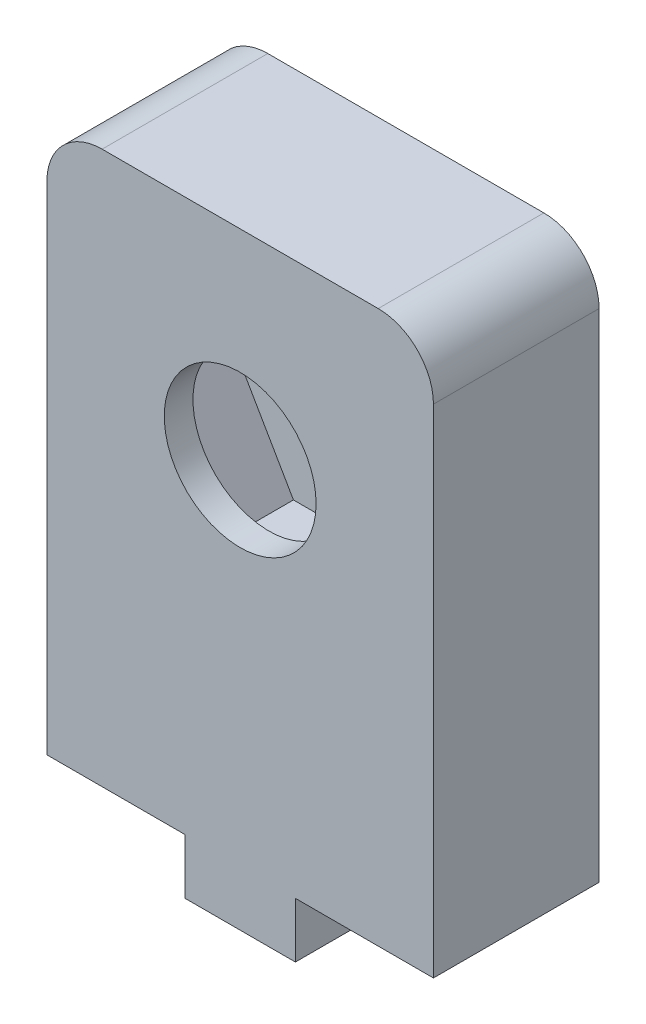
ISO-10303-21;
HEADER;
FILE_DESCRIPTION(('STEP AP214'),'2;1');
FILE_NAME('part.step','',(''),(''),'','','');
FILE_SCHEMA(('AUTOMOTIVE_DESIGN { 1 0 10303 214 1 1 1 1 }'));
ENDSEC;
DATA;
#1=APPLICATION_CONTEXT('core data for automotive mechanical design processes');
#2=APPLICATION_PROTOCOL_DEFINITION('international standard','automotive_design',2000,#1);
#3=PRODUCT_CONTEXT('',#1,'mechanical');
#4=PRODUCT('Part','Part','',(#3));
#5=PRODUCT_RELATED_PRODUCT_CATEGORY('part','',(#4));
#6=PRODUCT_DEFINITION_FORMATION('','',#4);
#7=PRODUCT_DEFINITION_CONTEXT('part definition',#1,'design');
#8=PRODUCT_DEFINITION('design','',#6,#7);
#9=PRODUCT_DEFINITION_SHAPE('','',#8);
#10=(LENGTH_UNIT() NAMED_UNIT(*) SI_UNIT(.MILLI.,.METRE.));
#11=(NAMED_UNIT(*) PLANE_ANGLE_UNIT() SI_UNIT($,.RADIAN.));
#12=(NAMED_UNIT(*) SI_UNIT($,.STERADIAN.) SOLID_ANGLE_UNIT());
#13=UNCERTAINTY_MEASURE_WITH_UNIT(LENGTH_MEASURE(1.E-05),#10,'distance_accuracy_value','');
#14=(GEOMETRIC_REPRESENTATION_CONTEXT(3) GLOBAL_UNCERTAINTY_ASSIGNED_CONTEXT((#13)) GLOBAL_UNIT_ASSIGNED_CONTEXT((#10,
#11,#12)) REPRESENTATION_CONTEXT('',''));
#15=CARTESIAN_POINT('',(0.,0.,0.));
#16=DIRECTION('',(0.,0.,1.));
#17=DIRECTION('',(1.,0.,0.));
#18=AXIS2_PLACEMENT_3D('',#15,#16,#17);
#19=CARTESIAN_POINT('',(0.,0.,3.));
#20=DIRECTION('',(0.,0.,-1.));
#21=DIRECTION('',(-1.,0.,0.));
#22=AXIS2_PLACEMENT_3D('',#19,#20,#21);
#23=CYLINDRICAL_SURFACE('',#22,1.375);
#24=CARTESIAN_POINT('',(0.,0.,0.));
#25=DIRECTION('',(0.,0.,1.));
#26=DIRECTION('',(1.,0.,0.));
#27=AXIS2_PLACEMENT_3D('',#24,#25,#26);
#28=CIRCLE('',#27,1.375);
#29=CARTESIAN_POINT('',(1.375,0.,0.));
#30=VERTEX_POINT('',#29);
#31=EDGE_CURVE('E197',#30,#30,#28,.T.);
#32=ORIENTED_EDGE('',*,*,#31,.F.);
#33=EDGE_LOOP('',(#32));
#34=FACE_BOUND('',#33,.T.);
#35=CARTESIAN_POINT('',(0.,0.,0.52));
#36=DIRECTION('',(0.,0.,1.));
#37=DIRECTION('',(1.,0.,0.));
#38=AXIS2_PLACEMENT_3D('',#35,#36,#37);
#39=CIRCLE('',#38,1.375);
#40=CARTESIAN_POINT('',(1.375,0.,0.52));
#41=VERTEX_POINT('',#40);
#42=EDGE_CURVE('E43',#41,#41,#39,.T.);
#43=ORIENTED_EDGE('',*,*,#42,.T.);
#44=EDGE_LOOP('',(#43));
#45=FACE_BOUND('',#44,.T.);
#46=ADVANCED_FACE('F39',(#34,#45),#23,.F.);
#47=CARTESIAN_POINT('',(2.50000000000001,2.625,3.));
#48=DIRECTION('',(0.,0.,1.));
#49=DIRECTION('',(1.,0.,0.));
#50=AXIS2_PLACEMENT_3D('',#47,#48,#49);
#51=PLANE('',#50);
#52=DIRECTION('',(1.,0.,0.));
#53=VECTOR('',#52,1.);
#54=CARTESIAN_POINT('',(1.,-6.375,3.));
#55=LINE('',#54,#53);
#56=CARTESIAN_POINT('',(1.,-6.375,3.));
#57=VERTEX_POINT('',#56);
#58=CARTESIAN_POINT('',(3.50000000000001,-6.375,3.));
#59=VERTEX_POINT('',#58);
#60=EDGE_CURVE('E173',#57,#59,#55,.T.);
#61=ORIENTED_EDGE('',*,*,#60,.T.);
#62=DIRECTION('',(0.,1.,0.));
#63=VECTOR('',#62,1.);
#64=CARTESIAN_POINT('',(3.50000000000001,2.625,3.));
#65=LINE('',#64,#63);
#66=CARTESIAN_POINT('',(3.50000000000001,2.625,3.));
#67=VERTEX_POINT('',#66);
#68=EDGE_CURVE('E107',#59,#67,#65,.T.);
#69=ORIENTED_EDGE('',*,*,#68,.T.);
#70=CARTESIAN_POINT('',(2.50000000000001,2.625,3.));
#71=DIRECTION('',(0.,0.,1.));
#72=DIRECTION('',(1.,0.,0.));
#73=AXIS2_PLACEMENT_3D('',#70,#71,#72);
#74=CIRCLE('',#73,1.);
#75=CARTESIAN_POINT('',(2.50000000000001,3.625,3.));
#76=VERTEX_POINT('',#75);
#77=EDGE_CURVE('E231',#67,#76,#74,.T.);
#78=ORIENTED_EDGE('',*,*,#77,.T.);
#79=DIRECTION('',(-1.,0.,0.));
#80=VECTOR('',#79,1.);
#81=CARTESIAN_POINT('',(-2.50000000000001,3.625,3.));
#82=LINE('',#81,#80);
#83=CARTESIAN_POINT('',(-2.50000000000001,3.625,3.));
#84=VERTEX_POINT('',#83);
#85=EDGE_CURVE('E232',#76,#84,#82,.T.);
#86=ORIENTED_EDGE('',*,*,#85,.T.);
#87=CARTESIAN_POINT('',(-2.50000000000001,2.625,3.));
#88=DIRECTION('',(0.,0.,1.));
#89=DIRECTION('',(1.,0.,0.));
#90=AXIS2_PLACEMENT_3D('',#87,#88,#89);
#91=CIRCLE('',#90,1.);
#92=CARTESIAN_POINT('',(-3.50000000000001,2.625,3.));
#93=VERTEX_POINT('',#92);
#94=EDGE_CURVE('E234',#84,#93,#91,.T.);
#95=ORIENTED_EDGE('',*,*,#94,.T.);
#96=DIRECTION('',(0.,-1.,0.));
#97=VECTOR('',#96,1.);
#98=CARTESIAN_POINT('',(-3.50000000000001,2.625,3.));
#99=LINE('',#98,#97);
#100=CARTESIAN_POINT('',(-3.50000000000001,-6.375,3.));
#101=VERTEX_POINT('',#100);
#102=EDGE_CURVE('E240',#93,#101,#99,.T.);
#103=ORIENTED_EDGE('',*,*,#102,.T.);
#104=DIRECTION('',(1.,0.,0.));
#105=VECTOR('',#104,1.);
#106=CARTESIAN_POINT('',(-3.50000000000001,-6.375,3.));
#107=LINE('',#106,#105);
#108=CARTESIAN_POINT('',(-1.,-6.375,3.));
#109=VERTEX_POINT('',#108);
#110=EDGE_CURVE('E140',#101,#109,#107,.T.);
#111=ORIENTED_EDGE('',*,*,#110,.T.);
#112=DIRECTION('',(0.,-1.,0.));
#113=VECTOR('',#112,1.);
#114=CARTESIAN_POINT('',(-1.,-6.375,3.));
#115=LINE('',#114,#113);
#116=CARTESIAN_POINT('',(-1.,-7.375,3.));
#117=VERTEX_POINT('',#116);
#118=EDGE_CURVE('E128',#109,#117,#115,.T.);
#119=ORIENTED_EDGE('',*,*,#118,.T.);
#120=DIRECTION('',(1.,0.,0.));
#121=VECTOR('',#120,1.);
#122=CARTESIAN_POINT('',(-1.,-7.375,3.));
#123=LINE('',#122,#121);
#124=CARTESIAN_POINT('',(1.,-7.375,3.));
#125=VERTEX_POINT('',#124);
#126=EDGE_CURVE('E134',#117,#125,#123,.T.);
#127=ORIENTED_EDGE('',*,*,#126,.T.);
#128=DIRECTION('',(0.,1.,0.));
#129=VECTOR('',#128,1.);
#130=CARTESIAN_POINT('',(1.,-7.375,3.));
#131=LINE('',#130,#129);
#132=EDGE_CURVE('E59',#125,#57,#131,.T.);
#133=ORIENTED_EDGE('',*,*,#132,.T.);
#134=EDGE_LOOP('',(#61,#69,#78,#86,#95,#103,#111,#119,#127,#133));
#135=FACE_BOUND('',#134,.T.);
#136=CARTESIAN_POINT('',(0.,0.,3.));
#137=DIRECTION('',(0.,0.,1.));
#138=DIRECTION('',(1.,0.,0.));
#139=AXIS2_PLACEMENT_3D('',#136,#137,#138);
#140=CIRCLE('',#139,1.375);
#141=CARTESIAN_POINT('',(1.375,0.,3.));
#142=VERTEX_POINT('',#141);
#143=EDGE_CURVE('E157',#142,#142,#140,.T.);
#144=ORIENTED_EDGE('',*,*,#143,.F.);
#145=EDGE_LOOP('',(#144));
#146=FACE_BOUND('',#145,.T.);
#147=ADVANCED_FACE('F135',(#135,#146),#51,.T.);
#148=CARTESIAN_POINT('',(2.50000000000001,2.625,0.));
#149=DIRECTION('',(0.,0.,1.));
#150=DIRECTION('',(1.,0.,0.));
#151=AXIS2_PLACEMENT_3D('',#148,#149,#150);
#152=PLANE('',#151);
#153=DIRECTION('',(1.,0.,0.));
#154=VECTOR('',#153,1.);
#155=CARTESIAN_POINT('',(1.,-6.375,0.));
#156=LINE('',#155,#154);
#157=CARTESIAN_POINT('',(1.,-6.375,0.));
#158=VERTEX_POINT('',#157);
#159=CARTESIAN_POINT('',(3.50000000000001,-6.375,0.));
#160=VERTEX_POINT('',#159);
#161=EDGE_CURVE('E154',#158,#160,#156,.T.);
#162=ORIENTED_EDGE('',*,*,#161,.F.);
#163=DIRECTION('',(0.,1.,0.));
#164=VECTOR('',#163,1.);
#165=CARTESIAN_POINT('',(1.,-7.375,0.));
#166=LINE('',#165,#164);
#167=CARTESIAN_POINT('',(1.,-7.375,0.));
#168=VERTEX_POINT('',#167);
#169=EDGE_CURVE('E99',#168,#158,#166,.T.);
#170=ORIENTED_EDGE('',*,*,#169,.F.);
#171=DIRECTION('',(1.,0.,0.));
#172=VECTOR('',#171,1.);
#173=CARTESIAN_POINT('',(-1.,-7.375,0.));
#174=LINE('',#173,#172);
#175=CARTESIAN_POINT('',(-1.,-7.375,0.));
#176=VERTEX_POINT('',#175);
#177=EDGE_CURVE('E94',#176,#168,#174,.T.);
#178=ORIENTED_EDGE('',*,*,#177,.F.);
#179=DIRECTION('',(0.,-1.,0.));
#180=VECTOR('',#179,1.);
#181=CARTESIAN_POINT('',(-1.,-6.375,0.));
#182=LINE('',#181,#180);
#183=CARTESIAN_POINT('',(-1.,-6.375,0.));
#184=VERTEX_POINT('',#183);
#185=EDGE_CURVE('E144',#184,#176,#182,.T.);
#186=ORIENTED_EDGE('',*,*,#185,.F.);
#187=DIRECTION('',(1.,0.,0.));
#188=VECTOR('',#187,1.);
#189=CARTESIAN_POINT('',(-3.50000000000001,-6.375,0.));
#190=LINE('',#189,#188);
#191=CARTESIAN_POINT('',(-3.50000000000001,-6.375,0.));
#192=VERTEX_POINT('',#191);
#193=EDGE_CURVE('E166',#192,#184,#190,.T.);
#194=ORIENTED_EDGE('',*,*,#193,.F.);
#195=DIRECTION('',(0.,-1.,0.));
#196=VECTOR('',#195,1.);
#197=CARTESIAN_POINT('',(-3.50000000000001,2.625,0.));
#198=LINE('',#197,#196);
#199=CARTESIAN_POINT('',(-3.50000000000001,2.625,0.));
#200=VERTEX_POINT('',#199);
#201=EDGE_CURVE('E170',#200,#192,#198,.T.);
#202=ORIENTED_EDGE('',*,*,#201,.F.);
#203=CARTESIAN_POINT('',(-2.50000000000001,2.625,0.));
#204=DIRECTION('',(0.,0.,1.));
#205=DIRECTION('',(1.,0.,0.));
#206=AXIS2_PLACEMENT_3D('',#203,#204,#205);
#207=CIRCLE('',#206,1.);
#208=CARTESIAN_POINT('',(-2.50000000000001,3.625,0.));
#209=VERTEX_POINT('',#208);
#210=EDGE_CURVE('E164',#209,#200,#207,.T.);
#211=ORIENTED_EDGE('',*,*,#210,.F.);
#212=DIRECTION('',(-1.,0.,0.));
#213=VECTOR('',#212,1.);
#214=CARTESIAN_POINT('',(-2.50000000000001,3.625,0.));
#215=LINE('',#214,#213);
#216=CARTESIAN_POINT('',(2.50000000000001,3.625,0.));
#217=VERTEX_POINT('',#216);
#218=EDGE_CURVE('E162',#217,#209,#215,.T.);
#219=ORIENTED_EDGE('',*,*,#218,.F.);
#220=CARTESIAN_POINT('',(2.50000000000001,2.625,0.));
#221=DIRECTION('',(0.,0.,1.));
#222=DIRECTION('',(1.,0.,0.));
#223=AXIS2_PLACEMENT_3D('',#220,#221,#222);
#224=CIRCLE('',#223,1.);
#225=CARTESIAN_POINT('',(3.50000000000001,2.625,0.));
#226=VERTEX_POINT('',#225);
#227=EDGE_CURVE('E161',#226,#217,#224,.T.);
#228=ORIENTED_EDGE('',*,*,#227,.F.);
#229=DIRECTION('',(0.,1.,0.));
#230=VECTOR('',#229,1.);
#231=CARTESIAN_POINT('',(3.50000000000001,2.625,0.));
#232=LINE('',#231,#230);
#233=EDGE_CURVE('E158',#160,#226,#232,.T.);
#234=ORIENTED_EDGE('',*,*,#233,.F.);
#235=EDGE_LOOP('',(#162,#170,#178,#186,#194,#202,#211,#219,#228,#234));
#236=FACE_BOUND('',#235,.T.);
#237=ORIENTED_EDGE('',*,*,#31,.T.);
#238=EDGE_LOOP('',(#237));
#239=FACE_BOUND('',#238,.T.);
#240=ADVANCED_FACE('F249',(#236,#239),#152,.F.);
#241=CARTESIAN_POINT('',(1.,-6.375,3.));
#242=DIRECTION('',(0.,1.,0.));
#243=DIRECTION('',(0.,0.,1.));
#244=AXIS2_PLACEMENT_3D('',#241,#242,#243);
#245=PLANE('',#244);
#246=ORIENTED_EDGE('',*,*,#161,.T.);
#247=DIRECTION('',(0.,0.,-1.));
#248=VECTOR('',#247,1.);
#249=CARTESIAN_POINT('',(3.50000000000001,-6.375,3.));
#250=LINE('',#249,#248);
#251=EDGE_CURVE('E11',#59,#160,#250,.T.);
#252=ORIENTED_EDGE('',*,*,#251,.F.);
#253=ORIENTED_EDGE('',*,*,#60,.F.);
#254=DIRECTION('',(0.,0.,-1.));
#255=VECTOR('',#254,1.);
#256=CARTESIAN_POINT('',(1.,-6.375,3.));
#257=LINE('',#256,#255);
#258=EDGE_CURVE('E151',#57,#158,#257,.T.);
#259=ORIENTED_EDGE('',*,*,#258,.T.);
#260=EDGE_LOOP('',(#246,#252,#253,#259));
#261=FACE_BOUND('',#260,.T.);
#262=ADVANCED_FACE('F41',(#261),#245,.F.);
#263=CARTESIAN_POINT('',(3.50000000000001,2.625,3.));
#264=DIRECTION('',(-1.,0.,0.));
#265=DIRECTION('',(0.,-1.,0.));
#266=AXIS2_PLACEMENT_3D('',#263,#264,#265);
#267=PLANE('',#266);
#268=ORIENTED_EDGE('',*,*,#233,.T.);
#269=DIRECTION('',(0.,0.,-1.));
#270=VECTOR('',#269,1.);
#271=CARTESIAN_POINT('',(3.50000000000001,2.625,3.));
#272=LINE('',#271,#270);
#273=EDGE_CURVE('E47',#67,#226,#272,.T.);
#274=ORIENTED_EDGE('',*,*,#273,.F.);
#275=ORIENTED_EDGE('',*,*,#68,.F.);
#276=ORIENTED_EDGE('',*,*,#251,.T.);
#277=EDGE_LOOP('',(#268,#274,#275,#276));
#278=FACE_BOUND('',#277,.T.);
#279=ADVANCED_FACE('F282',(#278),#267,.F.);
#280=CARTESIAN_POINT('',(2.50000000000001,2.625,3.));
#281=DIRECTION('',(0.,0.,-1.));
#282=DIRECTION('',(-1.,0.,0.));
#283=AXIS2_PLACEMENT_3D('',#280,#281,#282);
#284=CYLINDRICAL_SURFACE('',#283,1.);
#285=ORIENTED_EDGE('',*,*,#227,.T.);
#286=DIRECTION('',(0.,0.,-1.));
#287=VECTOR('',#286,1.);
#288=CARTESIAN_POINT('',(2.50000000000001,3.625,3.));
#289=LINE('',#288,#287);
#290=EDGE_CURVE('E190',#76,#217,#289,.T.);
#291=ORIENTED_EDGE('',*,*,#290,.F.);
#292=ORIENTED_EDGE('',*,*,#77,.F.);
#293=ORIENTED_EDGE('',*,*,#273,.T.);
#294=EDGE_LOOP('',(#285,#291,#292,#293));
#295=FACE_BOUND('',#294,.T.);
#296=ADVANCED_FACE('F290',(#295),#284,.T.);
#297=CARTESIAN_POINT('',(-2.50000000000001,3.625,3.));
#298=DIRECTION('',(0.,-1.,0.));
#299=DIRECTION('',(0.,0.,-1.));
#300=AXIS2_PLACEMENT_3D('',#297,#298,#299);
#301=PLANE('',#300);
#302=ORIENTED_EDGE('',*,*,#218,.T.);
#303=DIRECTION('',(0.,0.,-1.));
#304=VECTOR('',#303,1.);
#305=CARTESIAN_POINT('',(-2.50000000000001,3.625,3.));
#306=LINE('',#305,#304);
#307=EDGE_CURVE('E184',#84,#209,#306,.T.);
#308=ORIENTED_EDGE('',*,*,#307,.F.);
#309=ORIENTED_EDGE('',*,*,#85,.F.);
#310=ORIENTED_EDGE('',*,*,#290,.T.);
#311=EDGE_LOOP('',(#302,#308,#309,#310));
#312=FACE_BOUND('',#311,.T.);
#313=ADVANCED_FACE('F292',(#312),#301,.F.);
#314=CARTESIAN_POINT('',(-2.50000000000001,2.625,3.));
#315=DIRECTION('',(0.,0.,-1.));
#316=DIRECTION('',(-1.,0.,0.));
#317=AXIS2_PLACEMENT_3D('',#314,#315,#316);
#318=CYLINDRICAL_SURFACE('',#317,1.);
#319=ORIENTED_EDGE('',*,*,#210,.T.);
#320=DIRECTION('',(0.,0.,-1.));
#321=VECTOR('',#320,1.);
#322=CARTESIAN_POINT('',(-3.50000000000001,2.625,3.));
#323=LINE('',#322,#321);
#324=EDGE_CURVE('E182',#93,#200,#323,.T.);
#325=ORIENTED_EDGE('',*,*,#324,.F.);
#326=ORIENTED_EDGE('',*,*,#94,.F.);
#327=ORIENTED_EDGE('',*,*,#307,.T.);
#328=EDGE_LOOP('',(#319,#325,#326,#327));
#329=FACE_BOUND('',#328,.T.);
#330=ADVANCED_FACE('F300',(#329),#318,.T.);
#331=CARTESIAN_POINT('',(-3.50000000000001,2.625,3.));
#332=DIRECTION('',(1.,0.,0.));
#333=DIRECTION('',(0.,1.,0.));
#334=AXIS2_PLACEMENT_3D('',#331,#332,#333);
#335=PLANE('',#334);
#336=ORIENTED_EDGE('',*,*,#201,.T.);
#337=DIRECTION('',(0.,0.,-1.));
#338=VECTOR('',#337,1.);
#339=CARTESIAN_POINT('',(-3.50000000000001,-6.375,3.));
#340=LINE('',#339,#338);
#341=EDGE_CURVE('E177',#101,#192,#340,.T.);
#342=ORIENTED_EDGE('',*,*,#341,.F.);
#343=ORIENTED_EDGE('',*,*,#102,.F.);
#344=ORIENTED_EDGE('',*,*,#324,.T.);
#345=EDGE_LOOP('',(#336,#342,#343,#344));
#346=FACE_BOUND('',#345,.T.);
#347=ADVANCED_FACE('F242',(#346),#335,.F.);
#348=CARTESIAN_POINT('',(-3.50000000000001,-6.375,3.));
#349=DIRECTION('',(0.,1.,0.));
#350=DIRECTION('',(0.,0.,1.));
#351=AXIS2_PLACEMENT_3D('',#348,#349,#350);
#352=PLANE('',#351);
#353=ORIENTED_EDGE('',*,*,#193,.T.);
#354=DIRECTION('',(0.,0.,-1.));
#355=VECTOR('',#354,1.);
#356=CARTESIAN_POINT('',(-1.,-6.375,3.));
#357=LINE('',#356,#355);
#358=EDGE_CURVE('E148',#109,#184,#357,.T.);
#359=ORIENTED_EDGE('',*,*,#358,.F.);
#360=ORIENTED_EDGE('',*,*,#110,.F.);
#361=ORIENTED_EDGE('',*,*,#341,.T.);
#362=EDGE_LOOP('',(#353,#359,#360,#361));
#363=FACE_BOUND('',#362,.T.);
#364=ADVANCED_FACE('F250',(#363),#352,.F.);
#365=CARTESIAN_POINT('',(-1.,-6.375,3.));
#366=DIRECTION('',(1.,0.,0.));
#367=DIRECTION('',(0.,1.,0.));
#368=AXIS2_PLACEMENT_3D('',#365,#366,#367);
#369=PLANE('',#368);
#370=ORIENTED_EDGE('',*,*,#185,.T.);
#371=DIRECTION('',(0.,0.,-1.));
#372=VECTOR('',#371,1.);
#373=CARTESIAN_POINT('',(-1.,-7.375,3.));
#374=LINE('',#373,#372);
#375=EDGE_CURVE('E142',#117,#176,#374,.T.);
#376=ORIENTED_EDGE('',*,*,#375,.F.);
#377=ORIENTED_EDGE('',*,*,#118,.F.);
#378=ORIENTED_EDGE('',*,*,#358,.T.);
#379=EDGE_LOOP('',(#370,#376,#377,#378));
#380=FACE_BOUND('',#379,.T.);
#381=ADVANCED_FACE('F141',(#380),#369,.F.);
#382=CARTESIAN_POINT('',(-1.,-7.375,3.));
#383=DIRECTION('',(0.,1.,0.));
#384=DIRECTION('',(0.,0.,1.));
#385=AXIS2_PLACEMENT_3D('',#382,#383,#384);
#386=PLANE('',#385);
#387=ORIENTED_EDGE('',*,*,#177,.T.);
#388=DIRECTION('',(0.,0.,-1.));
#389=VECTOR('',#388,1.);
#390=CARTESIAN_POINT('',(1.,-7.375,3.));
#391=LINE('',#390,#389);
#392=EDGE_CURVE('E150',#125,#168,#391,.T.);
#393=ORIENTED_EDGE('',*,*,#392,.F.);
#394=ORIENTED_EDGE('',*,*,#126,.F.);
#395=ORIENTED_EDGE('',*,*,#375,.T.);
#396=EDGE_LOOP('',(#387,#393,#394,#395));
#397=FACE_BOUND('',#396,.T.);
#398=ADVANCED_FACE('F149',(#397),#386,.F.);
#399=CARTESIAN_POINT('',(1.,-7.375,3.));
#400=DIRECTION('',(-1.,0.,0.));
#401=DIRECTION('',(0.,-1.,0.));
#402=AXIS2_PLACEMENT_3D('',#399,#400,#401);
#403=PLANE('',#402);
#404=ORIENTED_EDGE('',*,*,#169,.T.);
#405=ORIENTED_EDGE('',*,*,#258,.F.);
#406=ORIENTED_EDGE('',*,*,#132,.F.);
#407=ORIENTED_EDGE('',*,*,#392,.T.);
#408=EDGE_LOOP('',(#404,#405,#406,#407));
#409=FACE_BOUND('',#408,.T.);
#410=ADVANCED_FACE('F258',(#409),#403,.F.);
#411=CARTESIAN_POINT('',(0.,0.,2.48));
#412=DIRECTION('',(0.,0.,1.));
#413=DIRECTION('',(1.,0.,0.));
#414=AXIS2_PLACEMENT_3D('',#411,#412,#413);
#415=CIRCLE('',#414,1.375);
#416=CARTESIAN_POINT('',(1.375,0.,2.48));
#417=VERTEX_POINT('',#416);
#418=EDGE_CURVE('E191',#417,#417,#415,.T.);
#419=ORIENTED_EDGE('',*,*,#418,.F.);
#420=EDGE_LOOP('',(#419));
#421=FACE_BOUND('',#420,.T.);
#422=ORIENTED_EDGE('',*,*,#143,.T.);
#423=EDGE_LOOP('',(#422));
#424=FACE_BOUND('',#423,.T.);
#425=ADVANCED_FACE('F256',(#421,#424),#23,.F.);
#426=CARTESIAN_POINT('',(-3.03108891324554,0.,0.52));
#427=DIRECTION('',(-0.866025403784439,-0.5,0.));
#428=DIRECTION('',(0.5,-0.866025403784439,0.));
#429=AXIS2_PLACEMENT_3D('',#426,#427,#428);
#430=PLANE('',#429);
#431=DIRECTION('',(0.5,-0.866025403784439,0.));
#432=VECTOR('',#431,1.);
#433=CARTESIAN_POINT('',(-3.03108891324554,0.,2.48));
#434=LINE('',#433,#432);
#435=CARTESIAN_POINT('',(-3.03108891324554,0.,2.48));
#436=VERTEX_POINT('',#435);
#437=CARTESIAN_POINT('',(-1.51554445662277,-2.625,2.48));
#438=VERTEX_POINT('',#437);
#439=EDGE_CURVE('E415',#436,#438,#434,.T.);
#440=ORIENTED_EDGE('',*,*,#439,.T.);
#441=DIRECTION('',(0.,0.,1.));
#442=VECTOR('',#441,1.);
#443=CARTESIAN_POINT('',(-1.51554445662277,-2.625,0.52));
#444=LINE('',#443,#442);
#445=CARTESIAN_POINT('',(-1.51554445662277,-2.625,0.52));
#446=VERTEX_POINT('',#445);
#447=EDGE_CURVE('E222',#446,#438,#444,.T.);
#448=ORIENTED_EDGE('',*,*,#447,.F.);
#449=DIRECTION('',(0.5,-0.866025403784439,0.));
#450=VECTOR('',#449,1.);
#451=CARTESIAN_POINT('',(-3.03108891324554,0.,0.52));
#452=LINE('',#451,#450);
#453=CARTESIAN_POINT('',(-3.03108891324554,0.,0.52));
#454=VERTEX_POINT('',#453);
#455=EDGE_CURVE('E426',#454,#446,#452,.T.);
#456=ORIENTED_EDGE('',*,*,#455,.F.);
#457=DIRECTION('',(0.,0.,1.));
#458=VECTOR('',#457,1.);
#459=CARTESIAN_POINT('',(-3.03108891324554,0.,0.52));
#460=LINE('',#459,#458);
#461=EDGE_CURVE('E192',#454,#436,#460,.T.);
#462=ORIENTED_EDGE('',*,*,#461,.T.);
#463=EDGE_LOOP('',(#440,#448,#456,#462));
#464=FACE_BOUND('',#463,.T.);
#465=ADVANCED_FACE('F264',(#464),#430,.F.);
#466=CARTESIAN_POINT('',(-1.51554445662277,2.625,0.52));
#467=DIRECTION('',(-0.866025403784439,0.5,0.));
#468=DIRECTION('',(-0.5,-0.866025403784439,0.));
#469=AXIS2_PLACEMENT_3D('',#466,#467,#468);
#470=PLANE('',#469);
#471=DIRECTION('',(-0.5,-0.866025403784439,0.));
#472=VECTOR('',#471,1.);
#473=CARTESIAN_POINT('',(-1.51554445662277,2.625,2.48));
#474=LINE('',#473,#472);
#475=CARTESIAN_POINT('',(-1.51554445662277,2.625,2.48));
#476=VERTEX_POINT('',#475);
#477=EDGE_CURVE('E209',#476,#436,#474,.T.);
#478=ORIENTED_EDGE('',*,*,#477,.T.);
#479=ORIENTED_EDGE('',*,*,#461,.F.);
#480=DIRECTION('',(-0.5,-0.866025403784439,0.));
#481=VECTOR('',#480,1.);
#482=CARTESIAN_POINT('',(-1.51554445662277,2.625,0.52));
#483=LINE('',#482,#481);
#484=CARTESIAN_POINT('',(-1.51554445662277,2.625,0.52));
#485=VERTEX_POINT('',#484);
#486=EDGE_CURVE('E221',#485,#454,#483,.T.);
#487=ORIENTED_EDGE('',*,*,#486,.F.);
#488=DIRECTION('',(0.,0.,1.));
#489=VECTOR('',#488,1.);
#490=CARTESIAN_POINT('',(-1.51554445662277,2.625,0.52));
#491=LINE('',#490,#489);
#492=EDGE_CURVE('E200',#485,#476,#491,.T.);
#493=ORIENTED_EDGE('',*,*,#492,.T.);
#494=EDGE_LOOP('',(#478,#479,#487,#493));
#495=FACE_BOUND('',#494,.T.);
#496=ADVANCED_FACE('F339',(#495),#470,.F.);
#497=CARTESIAN_POINT('',(1.51554445662277,2.625,0.52));
#498=DIRECTION('',(0.,1.,0.));
#499=DIRECTION('',(0.,0.,1.));
#500=AXIS2_PLACEMENT_3D('',#497,#498,#499);
#501=PLANE('',#500);
#502=DIRECTION('',(-1.,0.,0.));
#503=VECTOR('',#502,1.);
#504=CARTESIAN_POINT('',(1.51554445662277,2.625,2.48));
#505=LINE('',#504,#503);
#506=CARTESIAN_POINT('',(1.51554445662277,2.625,2.48));
#507=VERTEX_POINT('',#506);
#508=EDGE_CURVE('E430',#507,#476,#505,.T.);
#509=ORIENTED_EDGE('',*,*,#508,.T.);
#510=ORIENTED_EDGE('',*,*,#492,.F.);
#511=DIRECTION('',(-1.,0.,0.));
#512=VECTOR('',#511,1.);
#513=CARTESIAN_POINT('',(1.51554445662277,2.625,0.52));
#514=LINE('',#513,#512);
#515=CARTESIAN_POINT('',(1.51554445662277,2.625,0.52));
#516=VERTEX_POINT('',#515);
#517=EDGE_CURVE('E442',#516,#485,#514,.T.);
#518=ORIENTED_EDGE('',*,*,#517,.F.);
#519=DIRECTION('',(0.,0.,1.));
#520=VECTOR('',#519,1.);
#521=CARTESIAN_POINT('',(1.51554445662277,2.625,0.52));
#522=LINE('',#521,#520);
#523=EDGE_CURVE('E210',#516,#507,#522,.T.);
#524=ORIENTED_EDGE('',*,*,#523,.T.);
#525=EDGE_LOOP('',(#509,#510,#518,#524));
#526=FACE_BOUND('',#525,.T.);
#527=ADVANCED_FACE('F346',(#526),#501,.F.);
#528=CARTESIAN_POINT('',(3.03108891324554,0.,0.52));
#529=DIRECTION('',(0.866025403784439,0.5,0.));
#530=DIRECTION('',(-0.5,0.866025403784439,0.));
#531=AXIS2_PLACEMENT_3D('',#528,#529,#530);
#532=PLANE('',#531);
#533=DIRECTION('',(-0.5,0.866025403784439,0.));
#534=VECTOR('',#533,1.);
#535=CARTESIAN_POINT('',(3.03108891324554,0.,2.48));
#536=LINE('',#535,#534);
#537=CARTESIAN_POINT('',(3.03108891324554,0.,2.48));
#538=VERTEX_POINT('',#537);
#539=EDGE_CURVE('E431',#538,#507,#536,.T.);
#540=ORIENTED_EDGE('',*,*,#539,.T.);
#541=ORIENTED_EDGE('',*,*,#523,.F.);
#542=DIRECTION('',(-0.5,0.866025403784439,0.));
#543=VECTOR('',#542,1.);
#544=CARTESIAN_POINT('',(3.03108891324554,0.,0.52));
#545=LINE('',#544,#543);
#546=CARTESIAN_POINT('',(3.03108891324554,0.,0.52));
#547=VERTEX_POINT('',#546);
#548=EDGE_CURVE('E441',#547,#516,#545,.T.);
#549=ORIENTED_EDGE('',*,*,#548,.F.);
#550=DIRECTION('',(0.,0.,1.));
#551=VECTOR('',#550,1.);
#552=CARTESIAN_POINT('',(3.03108891324554,0.,0.52));
#553=LINE('',#552,#551);
#554=EDGE_CURVE('E214',#547,#538,#553,.T.);
#555=ORIENTED_EDGE('',*,*,#554,.T.);
#556=EDGE_LOOP('',(#540,#541,#549,#555));
#557=FACE_BOUND('',#556,.T.);
#558=ADVANCED_FACE('F357',(#557),#532,.F.);
#559=CARTESIAN_POINT('',(1.51554445662277,-2.625,0.52));
#560=DIRECTION('',(0.866025403784439,-0.5,0.));
#561=DIRECTION('',(0.5,0.866025403784439,0.));
#562=AXIS2_PLACEMENT_3D('',#559,#560,#561);
#563=PLANE('',#562);
#564=DIRECTION('',(0.5,0.866025403784439,0.));
#565=VECTOR('',#564,1.);
#566=CARTESIAN_POINT('',(1.51554445662277,-2.625,2.48));
#567=LINE('',#566,#565);
#568=CARTESIAN_POINT('',(1.51554445662277,-2.625,2.48));
#569=VERTEX_POINT('',#568);
#570=EDGE_CURVE('E433',#569,#538,#567,.T.);
#571=ORIENTED_EDGE('',*,*,#570,.T.);
#572=ORIENTED_EDGE('',*,*,#554,.F.);
#573=DIRECTION('',(0.5,0.866025403784439,0.));
#574=VECTOR('',#573,1.);
#575=CARTESIAN_POINT('',(1.51554445662277,-2.625,0.52));
#576=LINE('',#575,#574);
#577=CARTESIAN_POINT('',(1.51554445662277,-2.625,0.52));
#578=VERTEX_POINT('',#577);
#579=EDGE_CURVE('E450',#578,#547,#576,.T.);
#580=ORIENTED_EDGE('',*,*,#579,.F.);
#581=DIRECTION('',(0.,0.,1.));
#582=VECTOR('',#581,1.);
#583=CARTESIAN_POINT('',(1.51554445662277,-2.625,0.52));
#584=LINE('',#583,#582);
#585=EDGE_CURVE('E217',#578,#569,#584,.T.);
#586=ORIENTED_EDGE('',*,*,#585,.T.);
#587=EDGE_LOOP('',(#571,#572,#580,#586));
#588=FACE_BOUND('',#587,.T.);
#589=ADVANCED_FACE('F366',(#588),#563,.F.);
#590=CARTESIAN_POINT('',(-1.51554445662277,-2.625,0.52));
#591=DIRECTION('',(0.,-1.,0.));
#592=DIRECTION('',(0.,0.,-1.));
#593=AXIS2_PLACEMENT_3D('',#590,#591,#592);
#594=PLANE('',#593);
#595=DIRECTION('',(1.,0.,0.));
#596=VECTOR('',#595,1.);
#597=CARTESIAN_POINT('',(-1.51554445662277,-2.625,2.48));
#598=LINE('',#597,#596);
#599=EDGE_CURVE('E420',#438,#569,#598,.T.);
#600=ORIENTED_EDGE('',*,*,#599,.T.);
#601=ORIENTED_EDGE('',*,*,#585,.F.);
#602=DIRECTION('',(1.,0.,0.));
#603=VECTOR('',#602,1.);
#604=CARTESIAN_POINT('',(-1.51554445662277,-2.625,0.52));
#605=LINE('',#604,#603);
#606=EDGE_CURVE('E427',#446,#578,#605,.T.);
#607=ORIENTED_EDGE('',*,*,#606,.F.);
#608=ORIENTED_EDGE('',*,*,#447,.T.);
#609=EDGE_LOOP('',(#600,#601,#607,#608));
#610=FACE_BOUND('',#609,.T.);
#611=ADVANCED_FACE('F378',(#610),#594,.F.);
#612=CARTESIAN_POINT('',(0.,0.,0.52));
#613=DIRECTION('',(0.,0.,1.));
#614=DIRECTION('',(1.,0.,0.));
#615=AXIS2_PLACEMENT_3D('',#612,#613,#614);
#616=PLANE('',#615);
#617=ORIENTED_EDGE('',*,*,#42,.F.);
#618=EDGE_LOOP('',(#617));
#619=FACE_BOUND('',#618,.T.);
#620=ORIENTED_EDGE('',*,*,#455,.T.);
#621=ORIENTED_EDGE('',*,*,#606,.T.);
#622=ORIENTED_EDGE('',*,*,#579,.T.);
#623=ORIENTED_EDGE('',*,*,#548,.T.);
#624=ORIENTED_EDGE('',*,*,#517,.T.);
#625=ORIENTED_EDGE('',*,*,#486,.T.);
#626=EDGE_LOOP('',(#620,#621,#622,#623,#624,#625));
#627=FACE_BOUND('',#626,.T.);
#628=ADVANCED_FACE('F389',(#619,#627),#616,.T.);
#629=CARTESIAN_POINT('',(0.,0.,2.48));
#630=DIRECTION('',(0.,0.,1.));
#631=DIRECTION('',(1.,0.,0.));
#632=AXIS2_PLACEMENT_3D('',#629,#630,#631);
#633=PLANE('',#632);
#634=ORIENTED_EDGE('',*,*,#418,.T.);
#635=EDGE_LOOP('',(#634));
#636=FACE_BOUND('',#635,.T.);
#637=ORIENTED_EDGE('',*,*,#439,.F.);
#638=ORIENTED_EDGE('',*,*,#477,.F.);
#639=ORIENTED_EDGE('',*,*,#508,.F.);
#640=ORIENTED_EDGE('',*,*,#539,.F.);
#641=ORIENTED_EDGE('',*,*,#570,.F.);
#642=ORIENTED_EDGE('',*,*,#599,.F.);
#643=EDGE_LOOP('',(#637,#638,#639,#640,#641,#642));
#644=FACE_BOUND('',#643,.T.);
#645=ADVANCED_FACE('F400',(#636,#644),#633,.F.);
#646=CLOSED_SHELL('',(#46,#147,#240,#262,#279,#296,#313,#330,#347,#364,#381,#398,#410,#425,#465,
#496,#527,#558,#589,#611,#628,#645));
#647=MANIFOLD_SOLID_BREP('B2',#646);
#648=ADVANCED_BREP_SHAPE_REPRESENTATION('',(#18,#647),#14);
#649=SHAPE_DEFINITION_REPRESENTATION(#9,#648);
ENDSEC;
END-ISO-10303-21;
